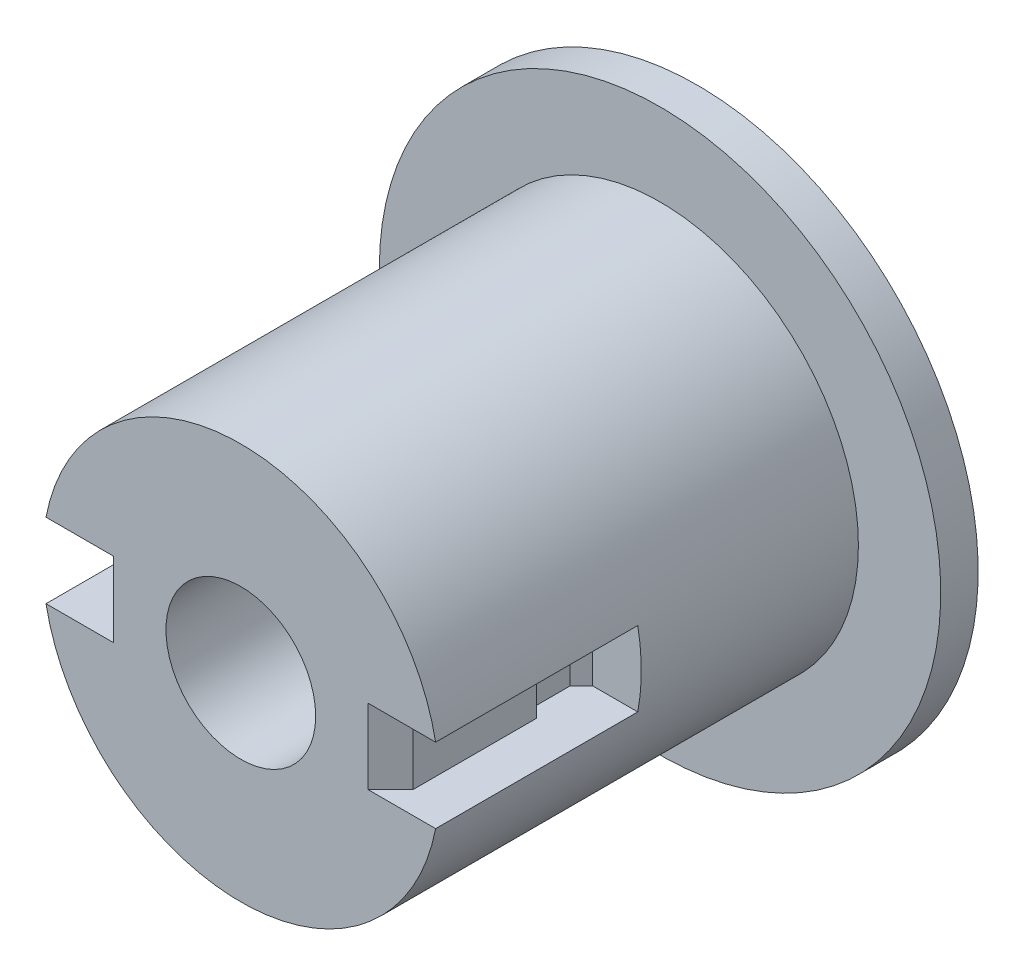
ISO-10303-21;
HEADER;
FILE_DESCRIPTION(('STEP AP214'),'2;1');
FILE_NAME('part.step','',(''),(''),'','','');
FILE_SCHEMA(('AUTOMOTIVE_DESIGN { 1 0 10303 214 1 1 1 1 }'));
ENDSEC;
DATA;
#1=APPLICATION_CONTEXT('core data for automotive mechanical design processes');
#2=APPLICATION_PROTOCOL_DEFINITION('international standard','automotive_design',2000,#1);
#3=PRODUCT_CONTEXT('',#1,'mechanical');
#4=PRODUCT('Part','Part','',(#3));
#5=PRODUCT_RELATED_PRODUCT_CATEGORY('part','',(#4));
#6=PRODUCT_DEFINITION_FORMATION('','',#4);
#7=PRODUCT_DEFINITION_CONTEXT('part definition',#1,'design');
#8=PRODUCT_DEFINITION('design','',#6,#7);
#9=PRODUCT_DEFINITION_SHAPE('','',#8);
#10=(LENGTH_UNIT() NAMED_UNIT(*) SI_UNIT(.MILLI.,.METRE.));
#11=(NAMED_UNIT(*) PLANE_ANGLE_UNIT() SI_UNIT($,.RADIAN.));
#12=(NAMED_UNIT(*) SI_UNIT($,.STERADIAN.) SOLID_ANGLE_UNIT());
#13=UNCERTAINTY_MEASURE_WITH_UNIT(LENGTH_MEASURE(1.E-05),#10,'distance_accuracy_value','');
#14=(GEOMETRIC_REPRESENTATION_CONTEXT(3) GLOBAL_UNCERTAINTY_ASSIGNED_CONTEXT((#13)) GLOBAL_UNIT_ASSIGNED_CONTEXT((#10,
#11,#12)) REPRESENTATION_CONTEXT('',''));
#15=CARTESIAN_POINT('',(0.,0.,0.));
#16=DIRECTION('',(0.,0.,1.));
#17=DIRECTION('',(1.,0.,0.));
#18=AXIS2_PLACEMENT_3D('',#15,#16,#17);
#19=CARTESIAN_POINT('',(0.,0.,56.));
#20=DIRECTION('',(0.,0.,-1.));
#21=DIRECTION('',(-1.,0.,0.));
#22=AXIS2_PLACEMENT_3D('',#19,#20,#21);
#23=CYLINDRICAL_SURFACE('',#22,26.5);
#24=CARTESIAN_POINT('',(0.,0.,29.));
#25=DIRECTION('',(0.,0.,-1.));
#26=DIRECTION('',(-1.,0.,0.));
#27=AXIS2_PLACEMENT_3D('',#24,#25,#26);
#28=CIRCLE('',#27,26.5);
#29=CARTESIAN_POINT('',(-26.0240273593462,-5.,29.));
#30=VERTEX_POINT('',#29);
#31=CARTESIAN_POINT('',(-26.0240273593462,5.,29.));
#32=VERTEX_POINT('',#31);
#33=EDGE_CURVE('E11',#30,#32,#28,.T.);
#34=ORIENTED_EDGE('',*,*,#33,.T.);
#35=DIRECTION('',(0.,0.,-1.));
#36=VECTOR('',#35,1.);
#37=CARTESIAN_POINT('',(-26.0240273593462,5.,56.));
#38=LINE('',#37,#36);
#39=CARTESIAN_POINT('',(-26.0240273593462,5.,56.));
#40=VERTEX_POINT('',#39);
#41=EDGE_CURVE('E209',#32,#40,#38,.F.);
#42=ORIENTED_EDGE('',*,*,#41,.T.);
#43=CARTESIAN_POINT('',(0.,0.,56.));
#44=DIRECTION('',(0.,0.,1.));
#45=DIRECTION('',(1.,0.,0.));
#46=AXIS2_PLACEMENT_3D('',#43,#44,#45);
#47=CIRCLE('',#46,26.5);
#48=CARTESIAN_POINT('',(26.0240273593462,5.,56.));
#49=VERTEX_POINT('',#48);
#50=EDGE_CURVE('E278',#49,#40,#47,.T.);
#51=ORIENTED_EDGE('',*,*,#50,.F.);
#52=DIRECTION('',(0.,0.,-1.));
#53=VECTOR('',#52,1.);
#54=CARTESIAN_POINT('',(26.0240273593462,5.,56.));
#55=LINE('',#54,#53);
#56=CARTESIAN_POINT('',(26.0240273593462,5.,29.));
#57=VERTEX_POINT('',#56);
#58=EDGE_CURVE('E259',#49,#57,#55,.T.);
#59=ORIENTED_EDGE('',*,*,#58,.T.);
#60=CARTESIAN_POINT('',(0.,0.,29.));
#61=DIRECTION('',(0.,0.,1.));
#62=DIRECTION('',(1.,0.,0.));
#63=AXIS2_PLACEMENT_3D('',#60,#61,#62);
#64=CIRCLE('',#63,26.5);
#65=CARTESIAN_POINT('',(26.0240273593462,-5.,29.));
#66=VERTEX_POINT('',#65);
#67=EDGE_CURVE('E40',#66,#57,#64,.T.);
#68=ORIENTED_EDGE('',*,*,#67,.F.);
#69=DIRECTION('',(0.,0.,-1.));
#70=VECTOR('',#69,1.);
#71=CARTESIAN_POINT('',(26.0240273593462,-5.,56.));
#72=LINE('',#71,#70);
#73=CARTESIAN_POINT('',(26.0240273593462,-5.,56.));
#74=VERTEX_POINT('',#73);
#75=EDGE_CURVE('E257',#74,#66,#72,.T.);
#76=ORIENTED_EDGE('',*,*,#75,.F.);
#77=CARTESIAN_POINT('',(-26.0240273593462,-5.,56.));
#78=VERTEX_POINT('',#77);
#79=EDGE_CURVE('E277',#78,#74,#47,.T.);
#80=ORIENTED_EDGE('',*,*,#79,.F.);
#81=DIRECTION('',(0.,0.,-1.));
#82=VECTOR('',#81,1.);
#83=CARTESIAN_POINT('',(-26.0240273593462,-5.,56.));
#84=LINE('',#83,#82);
#85=EDGE_CURVE('E47',#30,#78,#84,.F.);
#86=ORIENTED_EDGE('',*,*,#85,.F.);
#87=EDGE_LOOP('',(#34,#42,#51,#59,#68,#76,#80,#86));
#88=FACE_BOUND('',#87,.T.);
#89=CARTESIAN_POINT('',(0.,0.,0.));
#90=DIRECTION('',(0.,0.,-1.));
#91=DIRECTION('',(-1.,0.,0.));
#92=AXIS2_PLACEMENT_3D('',#89,#90,#91);
#93=CIRCLE('',#92,26.5);
#94=CARTESIAN_POINT('',(-26.5,0.,0.));
#95=VERTEX_POINT('',#94);
#96=EDGE_CURVE('E272',#95,#95,#93,.T.);
#97=ORIENTED_EDGE('',*,*,#96,.F.);
#98=EDGE_LOOP('',(#97));
#99=FACE_BOUND('',#98,.T.);
#100=ADVANCED_FACE('F33',(#88,#99),#23,.T.);
#101=CARTESIAN_POINT('',(0.,0.,56.));
#102=DIRECTION('',(0.,0.,1.));
#103=DIRECTION('',(1.,0.,0.));
#104=AXIS2_PLACEMENT_3D('',#101,#102,#103);
#105=PLANE('',#104);
#106=DIRECTION('',(-1.,0.,0.));
#107=VECTOR('',#106,1.);
#108=CARTESIAN_POINT('',(0.,5.,56.));
#109=LINE('',#108,#107);
#110=CARTESIAN_POINT('',(-17.,5.,56.));
#111=VERTEX_POINT('',#110);
#112=EDGE_CURVE('E184',#111,#40,#109,.T.);
#113=ORIENTED_EDGE('',*,*,#112,.F.);
#114=DIRECTION('',(0.,-1.,0.));
#115=VECTOR('',#114,1.);
#116=CARTESIAN_POINT('',(-17.,5.,56.));
#117=LINE('',#116,#115);
#118=CARTESIAN_POINT('',(-17.,-5.,56.));
#119=VERTEX_POINT('',#118);
#120=EDGE_CURVE('E162',#111,#119,#117,.T.);
#121=ORIENTED_EDGE('',*,*,#120,.T.);
#122=DIRECTION('',(-1.,0.,0.));
#123=VECTOR('',#122,1.);
#124=CARTESIAN_POINT('',(0.,-5.,56.));
#125=LINE('',#124,#123);
#126=EDGE_CURVE('E154',#119,#78,#125,.T.);
#127=ORIENTED_EDGE('',*,*,#126,.T.);
#128=ORIENTED_EDGE('',*,*,#79,.T.);
#129=DIRECTION('',(1.,0.,0.));
#130=VECTOR('',#129,1.);
#131=CARTESIAN_POINT('',(0.,-5.,56.));
#132=LINE('',#131,#130);
#133=CARTESIAN_POINT('',(17.,-5.,56.));
#134=VERTEX_POINT('',#133);
#135=EDGE_CURVE('E224',#134,#74,#132,.T.);
#136=ORIENTED_EDGE('',*,*,#135,.F.);
#137=DIRECTION('',(0.,-1.,0.));
#138=VECTOR('',#137,1.);
#139=CARTESIAN_POINT('',(17.,5.,56.));
#140=LINE('',#139,#138);
#141=CARTESIAN_POINT('',(17.,5.,56.));
#142=VERTEX_POINT('',#141);
#143=EDGE_CURVE('E247',#142,#134,#140,.T.);
#144=ORIENTED_EDGE('',*,*,#143,.F.);
#145=DIRECTION('',(1.,0.,0.));
#146=VECTOR('',#145,1.);
#147=CARTESIAN_POINT('',(0.,5.,56.));
#148=LINE('',#147,#146);
#149=EDGE_CURVE('E239',#142,#49,#148,.T.);
#150=ORIENTED_EDGE('',*,*,#149,.T.);
#151=ORIENTED_EDGE('',*,*,#50,.T.);
#152=EDGE_LOOP('',(#113,#121,#127,#128,#136,#144,#150,#151));
#153=FACE_BOUND('',#152,.T.);
#154=CARTESIAN_POINT('',(0.,0.,56.));
#155=DIRECTION('',(0.,0.,1.));
#156=DIRECTION('',(1.,0.,0.));
#157=AXIS2_PLACEMENT_3D('',#154,#155,#156);
#158=CIRCLE('',#157,10.);
#159=CARTESIAN_POINT('',(10.,0.,56.));
#160=VERTEX_POINT('',#159);
#161=EDGE_CURVE('E262',#160,#160,#158,.T.);
#162=ORIENTED_EDGE('',*,*,#161,.F.);
#163=EDGE_LOOP('',(#162));
#164=FACE_BOUND('',#163,.T.);
#165=ADVANCED_FACE('F297',(#153,#164),#105,.T.);
#166=CARTESIAN_POINT('',(0.,0.,0.));
#167=DIRECTION('',(0.,0.,-1.));
#168=DIRECTION('',(-1.,0.,0.));
#169=AXIS2_PLACEMENT_3D('',#166,#167,#168);
#170=PLANE('',#169);
#171=CARTESIAN_POINT('',(0.,0.,0.));
#172=DIRECTION('',(0.,0.,-1.));
#173=DIRECTION('',(-1.,0.,0.));
#174=AXIS2_PLACEMENT_3D('',#171,#172,#173);
#175=CIRCLE('',#174,37.5);
#176=CARTESIAN_POINT('',(-37.5,0.,0.));
#177=VERTEX_POINT('',#176);
#178=EDGE_CURVE('E266',#177,#177,#175,.T.);
#179=ORIENTED_EDGE('',*,*,#178,.F.);
#180=EDGE_LOOP('',(#179));
#181=FACE_BOUND('',#180,.T.);
#182=ORIENTED_EDGE('',*,*,#96,.T.);
#183=EDGE_LOOP('',(#182));
#184=FACE_BOUND('',#183,.T.);
#185=ADVANCED_FACE('F353',(#181,#184),#170,.F.);
#186=CARTESIAN_POINT('',(0.,0.,-5.));
#187=DIRECTION('',(0.,0.,1.));
#188=DIRECTION('',(1.,0.,0.));
#189=AXIS2_PLACEMENT_3D('',#186,#187,#188);
#190=CYLINDRICAL_SURFACE('',#189,37.5);
#191=CARTESIAN_POINT('',(0.,0.,-5.));
#192=DIRECTION('',(0.,0.,-1.));
#193=DIRECTION('',(-1.,0.,0.));
#194=AXIS2_PLACEMENT_3D('',#191,#192,#193);
#195=CIRCLE('',#194,37.5);
#196=CARTESIAN_POINT('',(-37.5,0.,-5.));
#197=VERTEX_POINT('',#196);
#198=EDGE_CURVE('E269',#197,#197,#195,.T.);
#199=ORIENTED_EDGE('',*,*,#198,.F.);
#200=EDGE_LOOP('',(#199));
#201=FACE_BOUND('',#200,.T.);
#202=ORIENTED_EDGE('',*,*,#178,.T.);
#203=EDGE_LOOP('',(#202));
#204=FACE_BOUND('',#203,.T.);
#205=ADVANCED_FACE('F357',(#201,#204),#190,.T.);
#206=CARTESIAN_POINT('',(0.,0.,-5.));
#207=DIRECTION('',(0.,0.,-1.));
#208=DIRECTION('',(-1.,0.,0.));
#209=AXIS2_PLACEMENT_3D('',#206,#207,#208);
#210=PLANE('',#209);
#211=CARTESIAN_POINT('',(0.,0.,-5.));
#212=DIRECTION('',(0.,0.,1.));
#213=DIRECTION('',(1.,0.,0.));
#214=AXIS2_PLACEMENT_3D('',#211,#212,#213);
#215=CIRCLE('',#214,10.);
#216=CARTESIAN_POINT('',(10.,0.,-5.));
#217=VERTEX_POINT('',#216);
#218=EDGE_CURVE('E263',#217,#217,#215,.T.);
#219=ORIENTED_EDGE('',*,*,#218,.T.);
#220=EDGE_LOOP('',(#219));
#221=FACE_BOUND('',#220,.T.);
#222=ORIENTED_EDGE('',*,*,#198,.T.);
#223=EDGE_LOOP('',(#222));
#224=FACE_BOUND('',#223,.T.);
#225=ADVANCED_FACE('F362',(#221,#224),#210,.T.);
#226=CARTESIAN_POINT('',(0.,0.,-5.));
#227=DIRECTION('',(0.,0.,1.));
#228=DIRECTION('',(1.,0.,0.));
#229=AXIS2_PLACEMENT_3D('',#226,#227,#228);
#230=CYLINDRICAL_SURFACE('',#229,10.);
#231=CARTESIAN_POINT('',(10.,0.,-5.));
#232=CARTESIAN_POINT('',(10.,0.,-4.36458333333333));
#233=CARTESIAN_POINT('',(10.,0.,-3.72916666666666));
#234=CARTESIAN_POINT('',(10.,0.,-2.45833333333333));
#235=CARTESIAN_POINT('',(10.,0.,-1.82291666666666));
#236=CARTESIAN_POINT('',(10.,0.,-0.552083333333332));
#237=CARTESIAN_POINT('',(10.,0.,0.0833333333333342));
#238=CARTESIAN_POINT('',(10.,0.,1.35416666666667));
#239=CARTESIAN_POINT('',(10.,0.,1.98958333333333));
#240=CARTESIAN_POINT('',(10.,0.,3.26041666666667));
#241=CARTESIAN_POINT('',(10.,0.,3.89583333333333));
#242=CARTESIAN_POINT('',(10.,0.,5.16666666666667));
#243=CARTESIAN_POINT('',(10.,0.,5.80208333333333));
#244=CARTESIAN_POINT('',(10.,0.,7.07291666666667));
#245=CARTESIAN_POINT('',(10.,0.,7.70833333333333));
#246=CARTESIAN_POINT('',(10.,0.,8.97916666666667));
#247=CARTESIAN_POINT('',(10.,0.,9.61458333333333));
#248=CARTESIAN_POINT('',(10.,0.,10.8854166666667));
#249=CARTESIAN_POINT('',(10.,0.,11.5208333333333));
#250=CARTESIAN_POINT('',(10.,0.,12.7916666666667));
#251=CARTESIAN_POINT('',(10.,0.,13.4270833333333));
#252=CARTESIAN_POINT('',(10.,0.,14.6979166666667));
#253=CARTESIAN_POINT('',(10.,0.,15.3333333333333));
#254=CARTESIAN_POINT('',(10.,0.,16.6041666666667));
#255=CARTESIAN_POINT('',(10.,0.,17.2395833333333));
#256=CARTESIAN_POINT('',(10.,0.,18.5104166666667));
#257=CARTESIAN_POINT('',(10.,0.,19.1458333333333));
#258=CARTESIAN_POINT('',(10.,0.,20.4166666666667));
#259=CARTESIAN_POINT('',(10.,0.,21.0520833333333));
#260=CARTESIAN_POINT('',(10.,0.,22.3229166666667));
#261=CARTESIAN_POINT('',(10.,0.,22.9583333333333));
#262=CARTESIAN_POINT('',(10.,0.,24.2291666666667));
#263=CARTESIAN_POINT('',(10.,0.,24.8645833333333));
#264=CARTESIAN_POINT('',(10.,0.,26.1354166666667));
#265=CARTESIAN_POINT('',(10.,0.,26.7708333333333));
#266=CARTESIAN_POINT('',(10.,0.,28.0416666666667));
#267=CARTESIAN_POINT('',(10.,0.,28.6770833333333));
#268=CARTESIAN_POINT('',(10.,0.,29.9479166666667));
#269=CARTESIAN_POINT('',(10.,0.,30.5833333333333));
#270=CARTESIAN_POINT('',(10.,0.,31.8541666666667));
#271=CARTESIAN_POINT('',(10.,0.,32.4895833333333));
#272=CARTESIAN_POINT('',(10.,0.,33.7604166666667));
#273=CARTESIAN_POINT('',(10.,0.,34.3958333333333));
#274=CARTESIAN_POINT('',(10.,0.,35.6666666666667));
#275=CARTESIAN_POINT('',(10.,0.,36.3020833333333));
#276=CARTESIAN_POINT('',(10.,0.,37.5729166666667));
#277=CARTESIAN_POINT('',(10.,0.,38.2083333333333));
#278=CARTESIAN_POINT('',(10.,0.,39.4791666666667));
#279=CARTESIAN_POINT('',(10.,0.,40.1145833333333));
#280=CARTESIAN_POINT('',(10.,0.,41.3854166666667));
#281=CARTESIAN_POINT('',(10.,0.,42.0208333333333));
#282=CARTESIAN_POINT('',(10.,0.,43.2916666666667));
#283=CARTESIAN_POINT('',(10.,0.,43.9270833333333));
#284=CARTESIAN_POINT('',(10.,0.,45.1979166666667));
#285=CARTESIAN_POINT('',(10.,0.,45.8333333333333));
#286=CARTESIAN_POINT('',(10.,0.,47.1041666666667));
#287=CARTESIAN_POINT('',(10.,0.,47.7395833333333));
#288=CARTESIAN_POINT('',(10.,0.,49.0104166666667));
#289=CARTESIAN_POINT('',(10.,0.,49.6458333333333));
#290=CARTESIAN_POINT('',(10.,0.,50.9166666666667));
#291=CARTESIAN_POINT('',(10.,0.,51.5520833333333));
#292=CARTESIAN_POINT('',(10.,0.,52.8229166666667));
#293=CARTESIAN_POINT('',(10.,0.,53.4583333333333));
#294=CARTESIAN_POINT('',(10.,0.,54.7291666666667));
#295=CARTESIAN_POINT('',(10.,0.,55.3645833333333));
#296=CARTESIAN_POINT('',(10.,0.,56.));
#297=B_SPLINE_CURVE_WITH_KNOTS('',3,(#231,#232,#233,#234,#235,#236,#237,#238,#239,#240,#241,
#242,#243,#244,#245,#246,#247,#248,#249,#250,#251,#252,#253,#254,#255,#256,#257,#258,#259,#260,
#261,#262,#263,#264,#265,#266,#267,#268,#269,#270,#271,#272,#273,#274,#275,#276,#277,#278,#279,
#280,#281,#282,#283,#284,#285,#286,#287,#288,#289,#290,#291,#292,#293,#294,#295,#296),
.UNSPECIFIED.,.F.,.F.,(4,2,2,2,2,2,2,2,2,2,2,2,2,2,2,2,2,2,2,2,2,2,2,2,2,2,2,2,2,2,2,2,4),(0.,
1.90625,3.8125,5.71875,7.625,9.53125,11.4375,13.34375,15.25,17.15625,19.0625,20.96875,22.875,
24.78125,26.6875,28.59375,30.5,32.40625,34.3125,36.21875,38.125,40.03125,41.9375,43.84375,45.75,
47.65625,49.5625,51.46875,53.375,55.28125,57.1875,59.09375,61.),.UNSPECIFIED.);
#298=EDGE_CURVE('BSEAM367',#217,#160,#297,.T.);
#299=ORIENTED_EDGE('',*,*,#218,.F.);
#300=ORIENTED_EDGE('',*,*,#161,.T.);
#301=ORIENTED_EDGE('',*,*,#298,.T.);
#302=ORIENTED_EDGE('',*,*,#298,.F.);
#303=EDGE_LOOP('',(#299,#301,#300,#302));
#304=FACE_BOUND('',#303,.T.);
#305=ADVANCED_FACE('F367',(#304),#230,.F.);
#306=CARTESIAN_POINT('',(0.,5.,29.));
#307=DIRECTION('',(0.,0.,1.));
#308=DIRECTION('',(1.,0.,0.));
#309=AXIS2_PLACEMENT_3D('',#306,#307,#308);
#310=PLANE('',#309);
#311=ORIENTED_EDGE('',*,*,#67,.T.);
#312=DIRECTION('',(-1.,0.,0.));
#313=VECTOR('',#312,1.);
#314=CARTESIAN_POINT('',(0.,5.,29.));
#315=LINE('',#314,#313);
#316=CARTESIAN_POINT('',(20.,5.,29.));
#317=VERTEX_POINT('',#316);
#318=EDGE_CURVE('E242',#57,#317,#315,.T.);
#319=ORIENTED_EDGE('',*,*,#318,.T.);
#320=DIRECTION('',(0.,-1.,0.));
#321=VECTOR('',#320,1.);
#322=CARTESIAN_POINT('',(20.,5.,29.));
#323=LINE('',#322,#321);
#324=CARTESIAN_POINT('',(20.,-5.,29.));
#325=VERTEX_POINT('',#324);
#326=EDGE_CURVE('E244',#317,#325,#323,.T.);
#327=ORIENTED_EDGE('',*,*,#326,.T.);
#328=DIRECTION('',(-1.,0.,0.));
#329=VECTOR('',#328,1.);
#330=CARTESIAN_POINT('',(0.,-5.,29.));
#331=LINE('',#330,#329);
#332=EDGE_CURVE('E226',#66,#325,#331,.T.);
#333=ORIENTED_EDGE('',*,*,#332,.F.);
#334=EDGE_LOOP('',(#311,#319,#327,#333));
#335=FACE_BOUND('',#334,.T.);
#336=ADVANCED_FACE('F284',(#335),#310,.T.);
#337=CARTESIAN_POINT('',(0.,5.,0.));
#338=DIRECTION('',(0.,1.,0.));
#339=DIRECTION('',(0.,0.,1.));
#340=AXIS2_PLACEMENT_3D('',#337,#338,#339);
#341=PLANE('',#340);
#342=ORIENTED_EDGE('',*,*,#149,.F.);
#343=DIRECTION('',(-0.707106781186546,0.,0.707106781186549));
#344=VECTOR('',#343,1.);
#345=CARTESIAN_POINT('',(36.5,5.,36.4999999999999));
#346=LINE('',#345,#344);
#347=CARTESIAN_POINT('',(20.,5.,53.));
#348=VERTEX_POINT('',#347);
#349=EDGE_CURVE('E237',#348,#142,#346,.T.);
#350=ORIENTED_EDGE('',*,*,#349,.F.);
#351=DIRECTION('',(0.,0.,1.));
#352=VECTOR('',#351,1.);
#353=CARTESIAN_POINT('',(20.,5.,0.));
#354=LINE('',#353,#352);
#355=CARTESIAN_POINT('',(20.,5.,36.5));
#356=VERTEX_POINT('',#355);
#357=EDGE_CURVE('E235',#356,#348,#354,.T.);
#358=ORIENTED_EDGE('',*,*,#357,.F.);
#359=DIRECTION('',(0.707106781186547,0.,0.707106781186548));
#360=VECTOR('',#359,1.);
#361=CARTESIAN_POINT('',(-8.24999999999998,5.,8.24999999999996));
#362=LINE('',#361,#360);
#363=CARTESIAN_POINT('',(18.5,5.,35.));
#364=VERTEX_POINT('',#363);
#365=EDGE_CURVE('E233',#364,#356,#362,.T.);
#366=ORIENTED_EDGE('',*,*,#365,.F.);
#367=DIRECTION('',(0.,0.,1.));
#368=VECTOR('',#367,1.);
#369=CARTESIAN_POINT('',(18.4999999999999,5.,0.));
#370=LINE('',#369,#368);
#371=CARTESIAN_POINT('',(18.5,5.,30.5));
#372=VERTEX_POINT('',#371);
#373=EDGE_CURVE('E231',#372,#364,#370,.T.);
#374=ORIENTED_EDGE('',*,*,#373,.F.);
#375=DIRECTION('',(-0.707106781186545,0.,0.70710678118655));
#376=VECTOR('',#375,1.);
#377=CARTESIAN_POINT('',(24.5000000000001,5.,24.4999999999999));
#378=LINE('',#377,#376);
#379=EDGE_CURVE('E228',#317,#372,#378,.T.);
#380=ORIENTED_EDGE('',*,*,#379,.F.);
#381=ORIENTED_EDGE('',*,*,#318,.F.);
#382=ORIENTED_EDGE('',*,*,#58,.F.);
#383=EDGE_LOOP('',(#342,#350,#358,#366,#374,#380,#381,#382));
#384=FACE_BOUND('',#383,.T.);
#385=ADVANCED_FACE('F291',(#384),#341,.F.);
#386=CARTESIAN_POINT('',(0.,-5.,0.));
#387=DIRECTION('',(0.,1.,0.));
#388=DIRECTION('',(0.,0.,1.));
#389=AXIS2_PLACEMENT_3D('',#386,#387,#388);
#390=PLANE('',#389);
#391=ORIENTED_EDGE('',*,*,#75,.T.);
#392=ORIENTED_EDGE('',*,*,#332,.T.);
#393=DIRECTION('',(-0.707106781186545,0.,0.70710678118655));
#394=VECTOR('',#393,1.);
#395=CARTESIAN_POINT('',(24.5000000000001,-5.,24.4999999999999));
#396=LINE('',#395,#394);
#397=CARTESIAN_POINT('',(18.5,-5.,30.5));
#398=VERTEX_POINT('',#397);
#399=EDGE_CURVE('E212',#325,#398,#396,.T.);
#400=ORIENTED_EDGE('',*,*,#399,.T.);
#401=DIRECTION('',(0.,0.,1.));
#402=VECTOR('',#401,1.);
#403=CARTESIAN_POINT('',(18.4999999999999,-5.,0.));
#404=LINE('',#403,#402);
#405=CARTESIAN_POINT('',(18.5,-5.,35.));
#406=VERTEX_POINT('',#405);
#407=EDGE_CURVE('E215',#398,#406,#404,.T.);
#408=ORIENTED_EDGE('',*,*,#407,.T.);
#409=DIRECTION('',(0.707106781186547,0.,0.707106781186548));
#410=VECTOR('',#409,1.);
#411=CARTESIAN_POINT('',(-8.24999999999998,-5.,8.24999999999996));
#412=LINE('',#411,#410);
#413=CARTESIAN_POINT('',(20.,-5.,36.5));
#414=VERTEX_POINT('',#413);
#415=EDGE_CURVE('E218',#406,#414,#412,.T.);
#416=ORIENTED_EDGE('',*,*,#415,.T.);
#417=DIRECTION('',(0.,0.,1.));
#418=VECTOR('',#417,1.);
#419=CARTESIAN_POINT('',(20.,-5.,0.));
#420=LINE('',#419,#418);
#421=CARTESIAN_POINT('',(20.,-5.,53.));
#422=VERTEX_POINT('',#421);
#423=EDGE_CURVE('E221',#414,#422,#420,.T.);
#424=ORIENTED_EDGE('',*,*,#423,.T.);
#425=DIRECTION('',(-0.707106781186546,0.,0.707106781186549));
#426=VECTOR('',#425,1.);
#427=CARTESIAN_POINT('',(36.5,-5.,36.4999999999999));
#428=LINE('',#427,#426);
#429=EDGE_CURVE('E55',#422,#134,#428,.T.);
#430=ORIENTED_EDGE('',*,*,#429,.T.);
#431=ORIENTED_EDGE('',*,*,#135,.T.);
#432=EDGE_LOOP('',(#391,#392,#400,#408,#416,#424,#430,#431));
#433=FACE_BOUND('',#432,.T.);
#434=ADVANCED_FACE('F322',(#433),#390,.T.);
#435=CARTESIAN_POINT('',(24.5000000000001,5.,24.4999999999999));
#436=DIRECTION('',(0.70710678118655,0.,0.707106781186545));
#437=DIRECTION('',(0.707106781186545,0.,-0.70710678118655));
#438=AXIS2_PLACEMENT_3D('',#435,#436,#437);
#439=PLANE('',#438);
#440=ORIENTED_EDGE('',*,*,#326,.F.);
#441=ORIENTED_EDGE('',*,*,#379,.T.);
#442=DIRECTION('',(0.,-1.,0.));
#443=VECTOR('',#442,1.);
#444=CARTESIAN_POINT('',(18.5,5.,30.5));
#445=LINE('',#444,#443);
#446=EDGE_CURVE('E255',#372,#398,#445,.T.);
#447=ORIENTED_EDGE('',*,*,#446,.T.);
#448=ORIENTED_EDGE('',*,*,#399,.F.);
#449=EDGE_LOOP('',(#440,#441,#447,#448));
#450=FACE_BOUND('',#449,.T.);
#451=ADVANCED_FACE('F318',(#450),#439,.T.);
#452=CARTESIAN_POINT('',(18.4999999999999,5.,0.));
#453=DIRECTION('',(1.,0.,0.));
#454=DIRECTION('',(0.,0.,-1.));
#455=AXIS2_PLACEMENT_3D('',#452,#453,#454);
#456=PLANE('',#455);
#457=ORIENTED_EDGE('',*,*,#446,.F.);
#458=ORIENTED_EDGE('',*,*,#373,.T.);
#459=DIRECTION('',(0.,-1.,0.));
#460=VECTOR('',#459,1.);
#461=CARTESIAN_POINT('',(18.5,5.,35.));
#462=LINE('',#461,#460);
#463=EDGE_CURVE('E253',#364,#406,#462,.T.);
#464=ORIENTED_EDGE('',*,*,#463,.T.);
#465=ORIENTED_EDGE('',*,*,#407,.F.);
#466=EDGE_LOOP('',(#457,#458,#464,#465));
#467=FACE_BOUND('',#466,.T.);
#468=ADVANCED_FACE('F321',(#467),#456,.T.);
#469=CARTESIAN_POINT('',(-8.24999999999998,5.,8.24999999999996));
#470=DIRECTION('',(0.707106781186548,0.,-0.707106781186547));
#471=DIRECTION('',(-0.707106781186547,0.,-0.707106781186548));
#472=AXIS2_PLACEMENT_3D('',#469,#470,#471);
#473=PLANE('',#472);
#474=ORIENTED_EDGE('',*,*,#463,.F.);
#475=ORIENTED_EDGE('',*,*,#365,.T.);
#476=DIRECTION('',(0.,-1.,0.));
#477=VECTOR('',#476,1.);
#478=CARTESIAN_POINT('',(20.,5.,36.5));
#479=LINE('',#478,#477);
#480=EDGE_CURVE('E251',#356,#414,#479,.T.);
#481=ORIENTED_EDGE('',*,*,#480,.T.);
#482=ORIENTED_EDGE('',*,*,#415,.F.);
#483=EDGE_LOOP('',(#474,#475,#481,#482));
#484=FACE_BOUND('',#483,.T.);
#485=ADVANCED_FACE('F314',(#484),#473,.T.);
#486=CARTESIAN_POINT('',(20.,5.,0.));
#487=DIRECTION('',(1.,0.,0.));
#488=DIRECTION('',(0.,0.,-1.));
#489=AXIS2_PLACEMENT_3D('',#486,#487,#488);
#490=PLANE('',#489);
#491=ORIENTED_EDGE('',*,*,#480,.F.);
#492=ORIENTED_EDGE('',*,*,#357,.T.);
#493=DIRECTION('',(0.,-1.,0.));
#494=VECTOR('',#493,1.);
#495=CARTESIAN_POINT('',(20.,5.,53.));
#496=LINE('',#495,#494);
#497=EDGE_CURVE('E249',#348,#422,#496,.T.);
#498=ORIENTED_EDGE('',*,*,#497,.T.);
#499=ORIENTED_EDGE('',*,*,#423,.F.);
#500=EDGE_LOOP('',(#491,#492,#498,#499));
#501=FACE_BOUND('',#500,.T.);
#502=ADVANCED_FACE('F310',(#501),#490,.T.);
#503=CARTESIAN_POINT('',(36.5,5.,36.4999999999999));
#504=DIRECTION('',(0.707106781186549,0.,0.707106781186546));
#505=DIRECTION('',(0.707106781186546,0.,-0.707106781186549));
#506=AXIS2_PLACEMENT_3D('',#503,#504,#505);
#507=PLANE('',#506);
#508=ORIENTED_EDGE('',*,*,#497,.F.);
#509=ORIENTED_EDGE('',*,*,#349,.T.);
#510=ORIENTED_EDGE('',*,*,#143,.T.);
#511=ORIENTED_EDGE('',*,*,#429,.F.);
#512=EDGE_LOOP('',(#508,#509,#510,#511));
#513=FACE_BOUND('',#512,.T.);
#514=ADVANCED_FACE('F306',(#513),#507,.T.);
#515=CARTESIAN_POINT('',(0.,5.,29.));
#516=DIRECTION('',(0.,0.,-1.));
#517=DIRECTION('',(-1.,0.,0.));
#518=AXIS2_PLACEMENT_3D('',#515,#516,#517);
#519=PLANE('',#518);
#520=ORIENTED_EDGE('',*,*,#33,.F.);
#521=DIRECTION('',(1.,0.,0.));
#522=VECTOR('',#521,1.);
#523=CARTESIAN_POINT('',(0.,-5.,29.));
#524=LINE('',#523,#522);
#525=CARTESIAN_POINT('',(-20.,-5.,29.));
#526=VERTEX_POINT('',#525);
#527=EDGE_CURVE('E147',#30,#526,#524,.T.);
#528=ORIENTED_EDGE('',*,*,#527,.T.);
#529=DIRECTION('',(0.,-1.,0.));
#530=VECTOR('',#529,1.);
#531=CARTESIAN_POINT('',(-20.,5.,29.));
#532=LINE('',#531,#530);
#533=CARTESIAN_POINT('',(-20.,5.,29.));
#534=VERTEX_POINT('',#533);
#535=EDGE_CURVE('E151',#534,#526,#532,.T.);
#536=ORIENTED_EDGE('',*,*,#535,.F.);
#537=DIRECTION('',(1.,0.,0.));
#538=VECTOR('',#537,1.);
#539=CARTESIAN_POINT('',(0.,5.,29.));
#540=LINE('',#539,#538);
#541=EDGE_CURVE('E182',#32,#534,#540,.T.);
#542=ORIENTED_EDGE('',*,*,#541,.F.);
#543=EDGE_LOOP('',(#520,#528,#536,#542));
#544=FACE_BOUND('',#543,.T.);
#545=ADVANCED_FACE('F149',(#544),#519,.F.);
#546=CARTESIAN_POINT('',(0.,5.,0.));
#547=DIRECTION('',(0.,1.,0.));
#548=DIRECTION('',(0.,0.,1.));
#549=AXIS2_PLACEMENT_3D('',#546,#547,#548);
#550=PLANE('',#549);
#551=ORIENTED_EDGE('',*,*,#541,.T.);
#552=DIRECTION('',(0.707106781186545,0.,0.70710678118655));
#553=VECTOR('',#552,1.);
#554=CARTESIAN_POINT('',(-24.5000000000001,5.,24.4999999999999));
#555=LINE('',#554,#553);
#556=CARTESIAN_POINT('',(-18.5,5.,30.5));
#557=VERTEX_POINT('',#556);
#558=EDGE_CURVE('E161',#534,#557,#555,.T.);
#559=ORIENTED_EDGE('',*,*,#558,.T.);
#560=DIRECTION('',(0.,0.,1.));
#561=VECTOR('',#560,1.);
#562=CARTESIAN_POINT('',(-18.4999999999999,5.,0.));
#563=LINE('',#562,#561);
#564=CARTESIAN_POINT('',(-18.5,5.,35.));
#565=VERTEX_POINT('',#564);
#566=EDGE_CURVE('E195',#557,#565,#563,.T.);
#567=ORIENTED_EDGE('',*,*,#566,.T.);
#568=DIRECTION('',(-0.707106781186547,0.,0.707106781186548));
#569=VECTOR('',#568,1.);
#570=CARTESIAN_POINT('',(8.24999999999998,5.,8.24999999999996));
#571=LINE('',#570,#569);
#572=CARTESIAN_POINT('',(-20.,5.,36.5));
#573=VERTEX_POINT('',#572);
#574=EDGE_CURVE('E192',#565,#573,#571,.T.);
#575=ORIENTED_EDGE('',*,*,#574,.T.);
#576=DIRECTION('',(0.,0.,1.));
#577=VECTOR('',#576,1.);
#578=CARTESIAN_POINT('',(-20.,5.,0.));
#579=LINE('',#578,#577);
#580=CARTESIAN_POINT('',(-20.,5.,53.));
#581=VERTEX_POINT('',#580);
#582=EDGE_CURVE('E189',#573,#581,#579,.T.);
#583=ORIENTED_EDGE('',*,*,#582,.T.);
#584=DIRECTION('',(0.707106781186546,0.,0.707106781186549));
#585=VECTOR('',#584,1.);
#586=CARTESIAN_POINT('',(-36.5,5.,36.4999999999999));
#587=LINE('',#586,#585);
#588=EDGE_CURVE('E186',#581,#111,#587,.T.);
#589=ORIENTED_EDGE('',*,*,#588,.T.);
#590=ORIENTED_EDGE('',*,*,#112,.T.);
#591=ORIENTED_EDGE('',*,*,#41,.F.);
#592=EDGE_LOOP('',(#551,#559,#567,#575,#583,#589,#590,#591));
#593=FACE_BOUND('',#592,.T.);
#594=ADVANCED_FACE('F339',(#593),#550,.F.);
#595=CARTESIAN_POINT('',(0.,-5.,0.));
#596=DIRECTION('',(0.,1.,0.));
#597=DIRECTION('',(0.,0.,1.));
#598=AXIS2_PLACEMENT_3D('',#595,#596,#597);
#599=PLANE('',#598);
#600=ORIENTED_EDGE('',*,*,#85,.T.);
#601=ORIENTED_EDGE('',*,*,#126,.F.);
#602=DIRECTION('',(0.707106781186546,0.,0.707106781186549));
#603=VECTOR('',#602,1.);
#604=CARTESIAN_POINT('',(-36.5,-5.,36.4999999999999));
#605=LINE('',#604,#603);
#606=CARTESIAN_POINT('',(-20.,-5.,53.));
#607=VERTEX_POINT('',#606);
#608=EDGE_CURVE('E172',#607,#119,#605,.T.);
#609=ORIENTED_EDGE('',*,*,#608,.F.);
#610=DIRECTION('',(0.,0.,1.));
#611=VECTOR('',#610,1.);
#612=CARTESIAN_POINT('',(-20.,-5.,0.));
#613=LINE('',#612,#611);
#614=CARTESIAN_POINT('',(-20.,-5.,36.5));
#615=VERTEX_POINT('',#614);
#616=EDGE_CURVE('E174',#615,#607,#613,.T.);
#617=ORIENTED_EDGE('',*,*,#616,.F.);
#618=DIRECTION('',(-0.707106781186547,0.,0.707106781186548));
#619=VECTOR('',#618,1.);
#620=CARTESIAN_POINT('',(8.24999999999998,-5.,8.24999999999996));
#621=LINE('',#620,#619);
#622=CARTESIAN_POINT('',(-18.5,-5.,35.));
#623=VERTEX_POINT('',#622);
#624=EDGE_CURVE('E177',#623,#615,#621,.T.);
#625=ORIENTED_EDGE('',*,*,#624,.F.);
#626=DIRECTION('',(0.,0.,1.));
#627=VECTOR('',#626,1.);
#628=CARTESIAN_POINT('',(-18.4999999999999,-5.,0.));
#629=LINE('',#628,#627);
#630=CARTESIAN_POINT('',(-18.5,-5.,30.5));
#631=VERTEX_POINT('',#630);
#632=EDGE_CURVE('E168',#631,#623,#629,.T.);
#633=ORIENTED_EDGE('',*,*,#632,.F.);
#634=DIRECTION('',(0.707106781186545,0.,0.70710678118655));
#635=VECTOR('',#634,1.);
#636=CARTESIAN_POINT('',(-24.5000000000001,-5.,24.4999999999999));
#637=LINE('',#636,#635);
#638=EDGE_CURVE('E155',#526,#631,#637,.T.);
#639=ORIENTED_EDGE('',*,*,#638,.F.);
#640=ORIENTED_EDGE('',*,*,#527,.F.);
#641=EDGE_LOOP('',(#600,#601,#609,#617,#625,#633,#639,#640));
#642=FACE_BOUND('',#641,.T.);
#643=ADVANCED_FACE('F165',(#642),#599,.T.);
#644=CARTESIAN_POINT('',(-24.5000000000001,5.,24.4999999999999));
#645=DIRECTION('',(0.70710678118655,0.,-0.707106781186545));
#646=DIRECTION('',(-0.707106781186545,0.,-0.70710678118655));
#647=AXIS2_PLACEMENT_3D('',#644,#645,#646);
#648=PLANE('',#647);
#649=DIRECTION('',(0.,-1.,0.));
#650=VECTOR('',#649,1.);
#651=CARTESIAN_POINT('',(-18.5,5.,30.5));
#652=LINE('',#651,#650);
#653=EDGE_CURVE('E198',#557,#631,#652,.T.);
#654=ORIENTED_EDGE('',*,*,#653,.F.);
#655=ORIENTED_EDGE('',*,*,#558,.F.);
#656=ORIENTED_EDGE('',*,*,#535,.T.);
#657=ORIENTED_EDGE('',*,*,#638,.T.);
#658=EDGE_LOOP('',(#654,#655,#656,#657));
#659=FACE_BOUND('',#658,.T.);
#660=ADVANCED_FACE('F159',(#659),#648,.F.);
#661=CARTESIAN_POINT('',(-36.5,5.,36.4999999999999));
#662=DIRECTION('',(0.707106781186549,0.,-0.707106781186546));
#663=DIRECTION('',(-0.707106781186546,0.,-0.707106781186549));
#664=AXIS2_PLACEMENT_3D('',#661,#662,#663);
#665=PLANE('',#664);
#666=ORIENTED_EDGE('',*,*,#120,.F.);
#667=ORIENTED_EDGE('',*,*,#588,.F.);
#668=DIRECTION('',(0.,-1.,0.));
#669=VECTOR('',#668,1.);
#670=CARTESIAN_POINT('',(-20.,5.,53.));
#671=LINE('',#670,#669);
#672=EDGE_CURVE('E204',#581,#607,#671,.T.);
#673=ORIENTED_EDGE('',*,*,#672,.T.);
#674=ORIENTED_EDGE('',*,*,#608,.T.);
#675=EDGE_LOOP('',(#666,#667,#673,#674));
#676=FACE_BOUND('',#675,.T.);
#677=ADVANCED_FACE('F327',(#676),#665,.F.);
#678=CARTESIAN_POINT('',(-20.,5.,0.));
#679=DIRECTION('',(1.,0.,0.));
#680=DIRECTION('',(0.,0.,-1.));
#681=AXIS2_PLACEMENT_3D('',#678,#679,#680);
#682=PLANE('',#681);
#683=ORIENTED_EDGE('',*,*,#672,.F.);
#684=ORIENTED_EDGE('',*,*,#582,.F.);
#685=DIRECTION('',(0.,-1.,0.));
#686=VECTOR('',#685,1.);
#687=CARTESIAN_POINT('',(-20.,5.,36.5));
#688=LINE('',#687,#686);
#689=EDGE_CURVE('E202',#573,#615,#688,.T.);
#690=ORIENTED_EDGE('',*,*,#689,.T.);
#691=ORIENTED_EDGE('',*,*,#616,.T.);
#692=EDGE_LOOP('',(#683,#684,#690,#691));
#693=FACE_BOUND('',#692,.T.);
#694=ADVANCED_FACE('F331',(#693),#682,.F.);
#695=CARTESIAN_POINT('',(8.24999999999998,5.,8.24999999999996));
#696=DIRECTION('',(0.707106781186548,0.,0.707106781186547));
#697=DIRECTION('',(0.707106781186547,0.,-0.707106781186548));
#698=AXIS2_PLACEMENT_3D('',#695,#696,#697);
#699=PLANE('',#698);
#700=ORIENTED_EDGE('',*,*,#689,.F.);
#701=ORIENTED_EDGE('',*,*,#574,.F.);
#702=DIRECTION('',(0.,-1.,0.));
#703=VECTOR('',#702,1.);
#704=CARTESIAN_POINT('',(-18.5,5.,35.));
#705=LINE('',#704,#703);
#706=EDGE_CURVE('E200',#565,#623,#705,.T.);
#707=ORIENTED_EDGE('',*,*,#706,.T.);
#708=ORIENTED_EDGE('',*,*,#624,.T.);
#709=EDGE_LOOP('',(#700,#701,#707,#708));
#710=FACE_BOUND('',#709,.T.);
#711=ADVANCED_FACE('F334',(#710),#699,.F.);
#712=CARTESIAN_POINT('',(-18.4999999999999,5.,0.));
#713=DIRECTION('',(1.,0.,0.));
#714=DIRECTION('',(0.,0.,-1.));
#715=AXIS2_PLACEMENT_3D('',#712,#713,#714);
#716=PLANE('',#715);
#717=ORIENTED_EDGE('',*,*,#706,.F.);
#718=ORIENTED_EDGE('',*,*,#566,.F.);
#719=ORIENTED_EDGE('',*,*,#653,.T.);
#720=ORIENTED_EDGE('',*,*,#632,.T.);
#721=EDGE_LOOP('',(#717,#718,#719,#720));
#722=FACE_BOUND('',#721,.T.);
#723=ADVANCED_FACE('F337',(#722),#716,.F.);
#724=CLOSED_SHELL('',(#100,#165,#185,#205,#225,#305,#336,#385,#434,#451,#468,#485,#502,#514,
#545,#594,#643,#660,#677,#694,#711,#723));
#725=MANIFOLD_SOLID_BREP('B2',#724);
#726=ADVANCED_BREP_SHAPE_REPRESENTATION('',(#18,#725),#14);
#727=SHAPE_DEFINITION_REPRESENTATION(#9,#726);
ENDSEC;
END-ISO-10303-21;
